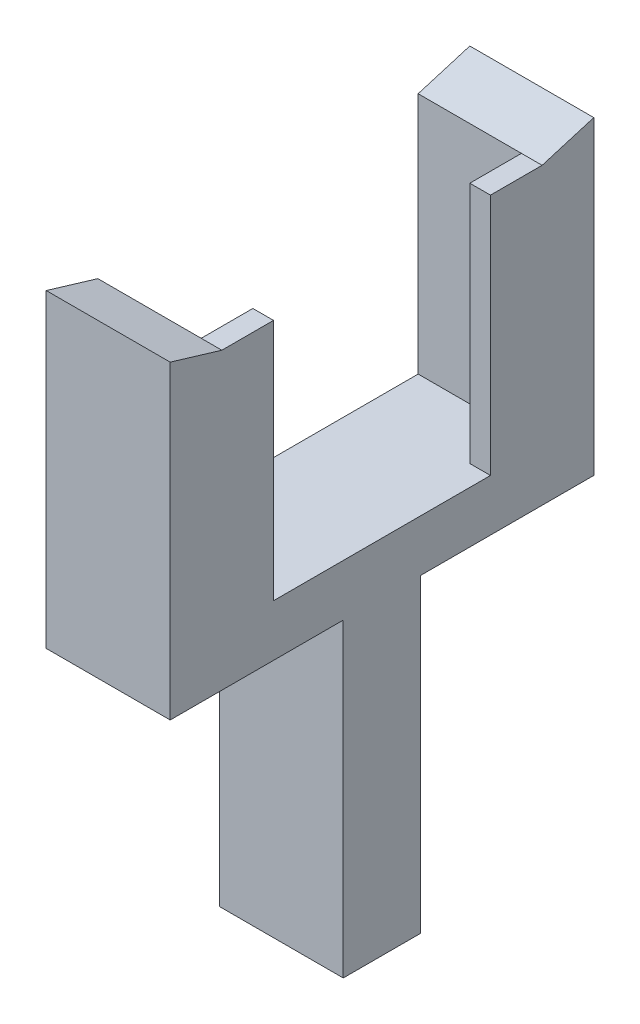
ISO-10303-21;
HEADER;
FILE_DESCRIPTION(('STEP AP214'),'2;1');
FILE_NAME('part.step','',(''),(''),'','','');
FILE_SCHEMA(('AUTOMOTIVE_DESIGN { 1 0 10303 214 1 1 1 1 }'));
ENDSEC;
DATA;
#1=APPLICATION_CONTEXT('core data for automotive mechanical design processes');
#2=APPLICATION_PROTOCOL_DEFINITION('international standard','automotive_design',2000,#1);
#3=PRODUCT_CONTEXT('',#1,'mechanical');
#4=PRODUCT('Part','Part','',(#3));
#5=PRODUCT_RELATED_PRODUCT_CATEGORY('part','',(#4));
#6=PRODUCT_DEFINITION_FORMATION('','',#4);
#7=PRODUCT_DEFINITION_CONTEXT('part definition',#1,'design');
#8=PRODUCT_DEFINITION('design','',#6,#7);
#9=PRODUCT_DEFINITION_SHAPE('','',#8);
#10=(LENGTH_UNIT() NAMED_UNIT(*) SI_UNIT(.MILLI.,.METRE.));
#11=(NAMED_UNIT(*) PLANE_ANGLE_UNIT() SI_UNIT($,.RADIAN.));
#12=(NAMED_UNIT(*) SI_UNIT($,.STERADIAN.) SOLID_ANGLE_UNIT());
#13=UNCERTAINTY_MEASURE_WITH_UNIT(LENGTH_MEASURE(1.E-05),#10,'distance_accuracy_value','');
#14=(GEOMETRIC_REPRESENTATION_CONTEXT(3) GLOBAL_UNCERTAINTY_ASSIGNED_CONTEXT((#13)) GLOBAL_UNIT_ASSIGNED_CONTEXT((#10,
#11,#12)) REPRESENTATION_CONTEXT('',''));
#15=CARTESIAN_POINT('',(0.,0.,0.));
#16=DIRECTION('',(0.,0.,1.));
#17=DIRECTION('',(1.,0.,0.));
#18=AXIS2_PLACEMENT_3D('',#15,#16,#17);
#19=CARTESIAN_POINT('',(6.,5.64115646258503,15.5));
#20=DIRECTION('',(0.,-1.,0.));
#21=DIRECTION('',(0.,0.,-1.));
#22=AXIS2_PLACEMENT_3D('',#19,#20,#21);
#23=PLANE('',#22);
#24=DIRECTION('',(-1.,0.,0.));
#25=VECTOR('',#24,1.);
#26=CARTESIAN_POINT('',(6.,5.64115646258503,-10.5));
#27=LINE('',#26,#25);
#28=CARTESIAN_POINT('',(6.,5.64115646258503,-10.5));
#29=VERTEX_POINT('',#28);
#30=CARTESIAN_POINT('',(4.,5.64115646258503,-10.5));
#31=VERTEX_POINT('',#30);
#32=EDGE_CURVE('E316',#29,#31,#27,.T.);
#33=ORIENTED_EDGE('',*,*,#32,.T.);
#34=DIRECTION('',(0.,0.,-1.));
#35=VECTOR('',#34,1.);
#36=CARTESIAN_POINT('',(4.,5.64115646258503,-10.5));
#37=LINE('',#36,#35);
#38=CARTESIAN_POINT('',(4.,5.64115646258503,-15.5));
#39=VERTEX_POINT('',#38);
#40=EDGE_CURVE('E312',#31,#39,#37,.T.);
#41=ORIENTED_EDGE('',*,*,#40,.T.);
#42=DIRECTION('',(-1.,0.,0.));
#43=VECTOR('',#42,1.);
#44=CARTESIAN_POINT('',(6.,5.64115646258503,-15.5));
#45=LINE('',#44,#43);
#46=CARTESIAN_POINT('',(-6.,5.64115646258503,-15.5));
#47=VERTEX_POINT('',#46);
#48=EDGE_CURVE('E215',#39,#47,#45,.T.);
#49=ORIENTED_EDGE('',*,*,#48,.T.);
#50=DIRECTION('',(0.,0.,1.));
#51=VECTOR('',#50,1.);
#52=CARTESIAN_POINT('',(-6.,5.64115646258503,15.5));
#53=LINE('',#52,#51);
#54=CARTESIAN_POINT('',(-6.,5.64115646258503,15.5));
#55=VERTEX_POINT('',#54);
#56=EDGE_CURVE('E183',#47,#55,#53,.T.);
#57=ORIENTED_EDGE('',*,*,#56,.T.);
#58=DIRECTION('',(-1.,0.,0.));
#59=VECTOR('',#58,1.);
#60=CARTESIAN_POINT('',(6.,5.64115646258503,15.5));
#61=LINE('',#60,#59);
#62=CARTESIAN_POINT('',(4.,5.64115646258503,15.5));
#63=VERTEX_POINT('',#62);
#64=EDGE_CURVE('E212',#63,#55,#61,.T.);
#65=ORIENTED_EDGE('',*,*,#64,.F.);
#66=DIRECTION('',(0.,0.,1.));
#67=VECTOR('',#66,1.);
#68=CARTESIAN_POINT('',(4.,5.64115646258503,10.5));
#69=LINE('',#68,#67);
#70=CARTESIAN_POINT('',(4.,5.64115646258503,10.5));
#71=VERTEX_POINT('',#70);
#72=EDGE_CURVE('E166',#71,#63,#69,.T.);
#73=ORIENTED_EDGE('',*,*,#72,.F.);
#74=DIRECTION('',(-1.,0.,0.));
#75=VECTOR('',#74,1.);
#76=CARTESIAN_POINT('',(6.,5.64115646258503,10.5));
#77=LINE('',#76,#75);
#78=CARTESIAN_POINT('',(6.,5.64115646258503,10.5));
#79=VERTEX_POINT('',#78);
#80=EDGE_CURVE('E298',#79,#71,#77,.T.);
#81=ORIENTED_EDGE('',*,*,#80,.F.);
#82=DIRECTION('',(0.,0.,1.));
#83=VECTOR('',#82,1.);
#84=CARTESIAN_POINT('',(6.,5.64115646258503,15.5));
#85=LINE('',#84,#83);
#86=EDGE_CURVE('E258',#29,#79,#85,.T.);
#87=ORIENTED_EDGE('',*,*,#86,.F.);
#88=EDGE_LOOP('',(#33,#41,#49,#57,#65,#73,#81,#87));
#89=FACE_BOUND('',#88,.T.);
#90=ADVANCED_FACE('F39',(#89),#23,.F.);
#91=CARTESIAN_POINT('',(6.,29.141156462585,15.5));
#92=DIRECTION('',(0.,0.,1.));
#93=DIRECTION('',(0.,-1.,0.));
#94=AXIS2_PLACEMENT_3D('',#91,#92,#93);
#95=PLANE('',#94);
#96=DIRECTION('',(0.,1.,0.));
#97=VECTOR('',#96,1.);
#98=CARTESIAN_POINT('',(4.,29.141156462585,15.5));
#99=LINE('',#98,#97);
#100=CARTESIAN_POINT('',(4.,29.141156462585,15.5));
#101=VERTEX_POINT('',#100);
#102=EDGE_CURVE('E285',#63,#101,#99,.T.);
#103=ORIENTED_EDGE('',*,*,#102,.F.);
#104=ORIENTED_EDGE('',*,*,#64,.T.);
#105=DIRECTION('',(0.,1.,0.));
#106=VECTOR('',#105,1.);
#107=CARTESIAN_POINT('',(-6.,29.141156462585,15.5));
#108=LINE('',#107,#106);
#109=CARTESIAN_POINT('',(-6.,29.141156462585,15.5));
#110=VERTEX_POINT('',#109);
#111=EDGE_CURVE('E187',#55,#110,#108,.T.);
#112=ORIENTED_EDGE('',*,*,#111,.T.);
#113=DIRECTION('',(-1.,0.,0.));
#114=VECTOR('',#113,1.);
#115=CARTESIAN_POINT('',(6.,29.141156462585,15.5));
#116=LINE('',#115,#114);
#117=EDGE_CURVE('E207',#101,#110,#116,.T.);
#118=ORIENTED_EDGE('',*,*,#117,.F.);
#119=EDGE_LOOP('',(#103,#104,#112,#118));
#120=FACE_BOUND('',#119,.T.);
#121=ADVANCED_FACE('F394',(#120),#95,.F.);
#122=CARTESIAN_POINT('',(6.,-29.358843537415,3.74999999999999));
#123=DIRECTION('',(0.,1.,0.));
#124=DIRECTION('',(0.,0.,1.));
#125=AXIS2_PLACEMENT_3D('',#122,#123,#124);
#126=PLANE('',#125);
#127=DIRECTION('',(0.,0.,-1.));
#128=VECTOR('',#127,1.);
#129=CARTESIAN_POINT('',(-6.,-29.358843537415,3.74999999999999));
#130=LINE('',#129,#128);
#131=CARTESIAN_POINT('',(-6.,-29.358843537415,3.74999999999999));
#132=VERTEX_POINT('',#131);
#133=CARTESIAN_POINT('',(-6.,-29.358843537415,-3.75000000000001));
#134=VERTEX_POINT('',#133);
#135=EDGE_CURVE('E161',#132,#134,#130,.T.);
#136=ORIENTED_EDGE('',*,*,#135,.T.);
#137=DIRECTION('',(-1.,0.,0.));
#138=VECTOR('',#137,1.);
#139=CARTESIAN_POINT('',(6.,-29.358843537415,-3.75000000000001));
#140=LINE('',#139,#138);
#141=CARTESIAN_POINT('',(6.,-29.358843537415,-3.75000000000001));
#142=VERTEX_POINT('',#141);
#143=EDGE_CURVE('E11',#142,#134,#140,.T.);
#144=ORIENTED_EDGE('',*,*,#143,.F.);
#145=DIRECTION('',(0.,0.,-1.));
#146=VECTOR('',#145,1.);
#147=CARTESIAN_POINT('',(6.,-29.358843537415,3.74999999999999));
#148=LINE('',#147,#146);
#149=CARTESIAN_POINT('',(6.,-29.358843537415,3.74999999999999));
#150=VERTEX_POINT('',#149);
#151=EDGE_CURVE('E200',#150,#142,#148,.T.);
#152=ORIENTED_EDGE('',*,*,#151,.F.);
#153=DIRECTION('',(-1.,0.,0.));
#154=VECTOR('',#153,1.);
#155=CARTESIAN_POINT('',(6.,-29.358843537415,3.74999999999999));
#156=LINE('',#155,#154);
#157=EDGE_CURVE('E157',#150,#132,#156,.T.);
#158=ORIENTED_EDGE('',*,*,#157,.T.);
#159=EDGE_LOOP('',(#136,#144,#152,#158));
#160=FACE_BOUND('',#159,.T.);
#161=ADVANCED_FACE('F41',(#160),#126,.F.);
#162=CARTESIAN_POINT('',(6.,-29.358843537415,-3.75000000000001));
#163=DIRECTION('',(0.,0.,1.));
#164=DIRECTION('',(0.,-1.,0.));
#165=AXIS2_PLACEMENT_3D('',#162,#163,#164);
#166=PLANE('',#165);
#167=DIRECTION('',(0.,1.,0.));
#168=VECTOR('',#167,1.);
#169=CARTESIAN_POINT('',(-6.,-29.358843537415,-3.75000000000001));
#170=LINE('',#169,#168);
#171=CARTESIAN_POINT('',(-6.,0.641156462585026,-3.75));
#172=VERTEX_POINT('',#171);
#173=EDGE_CURVE('E165',#134,#172,#170,.T.);
#174=ORIENTED_EDGE('',*,*,#173,.T.);
#175=DIRECTION('',(-1.,0.,0.));
#176=VECTOR('',#175,1.);
#177=CARTESIAN_POINT('',(6.,0.641156462585026,-3.75));
#178=LINE('',#177,#176);
#179=CARTESIAN_POINT('',(6.,0.641156462585026,-3.75));
#180=VERTEX_POINT('',#179);
#181=EDGE_CURVE('E49',#180,#172,#178,.T.);
#182=ORIENTED_EDGE('',*,*,#181,.F.);
#183=DIRECTION('',(0.,1.,0.));
#184=VECTOR('',#183,1.);
#185=CARTESIAN_POINT('',(6.,-29.358843537415,-3.75000000000001));
#186=LINE('',#185,#184);
#187=EDGE_CURVE('E113',#142,#180,#186,.T.);
#188=ORIENTED_EDGE('',*,*,#187,.F.);
#189=ORIENTED_EDGE('',*,*,#143,.T.);
#190=EDGE_LOOP('',(#174,#182,#188,#189));
#191=FACE_BOUND('',#190,.T.);
#192=ADVANCED_FACE('F426',(#191),#166,.F.);
#193=CARTESIAN_POINT('',(6.,0.641156462585026,-3.75));
#194=DIRECTION('',(0.,1.,0.));
#195=DIRECTION('',(0.,0.,1.));
#196=AXIS2_PLACEMENT_3D('',#193,#194,#195);
#197=PLANE('',#196);
#198=DIRECTION('',(0.,0.,-1.));
#199=VECTOR('',#198,1.);
#200=CARTESIAN_POINT('',(-6.,0.641156462585026,-3.75));
#201=LINE('',#200,#199);
#202=CARTESIAN_POINT('',(-6.,0.641156462585028,-20.5));
#203=VERTEX_POINT('',#202);
#204=EDGE_CURVE('E169',#172,#203,#201,.T.);
#205=ORIENTED_EDGE('',*,*,#204,.T.);
#206=DIRECTION('',(-1.,0.,0.));
#207=VECTOR('',#206,1.);
#208=CARTESIAN_POINT('',(6.,0.641156462585028,-20.5));
#209=LINE('',#208,#207);
#210=CARTESIAN_POINT('',(6.,0.641156462585028,-20.5));
#211=VERTEX_POINT('',#210);
#212=EDGE_CURVE('E227',#211,#203,#209,.T.);
#213=ORIENTED_EDGE('',*,*,#212,.F.);
#214=DIRECTION('',(0.,0.,-1.));
#215=VECTOR('',#214,1.);
#216=CARTESIAN_POINT('',(6.,0.641156462585026,-3.75));
#217=LINE('',#216,#215);
#218=EDGE_CURVE('E237',#180,#211,#217,.T.);
#219=ORIENTED_EDGE('',*,*,#218,.F.);
#220=ORIENTED_EDGE('',*,*,#181,.T.);
#221=EDGE_LOOP('',(#205,#213,#219,#220));
#222=FACE_BOUND('',#221,.T.);
#223=ADVANCED_FACE('F235',(#222),#197,.F.);
#224=CARTESIAN_POINT('',(6.,0.641156462585028,-20.5));
#225=DIRECTION('',(0.,0.,1.));
#226=DIRECTION('',(0.,-1.,0.));
#227=AXIS2_PLACEMENT_3D('',#224,#225,#226);
#228=PLANE('',#227);
#229=DIRECTION('',(0.,1.,0.));
#230=VECTOR('',#229,1.);
#231=CARTESIAN_POINT('',(-6.,0.641156462585028,-20.5));
#232=LINE('',#231,#230);
#233=CARTESIAN_POINT('',(-6.,30.641156462585,-20.5));
#234=VERTEX_POINT('',#233);
#235=EDGE_CURVE('E172',#203,#234,#232,.T.);
#236=ORIENTED_EDGE('',*,*,#235,.T.);
#237=DIRECTION('',(-1.,0.,0.));
#238=VECTOR('',#237,1.);
#239=CARTESIAN_POINT('',(6.,30.641156462585,-20.5));
#240=LINE('',#239,#238);
#241=CARTESIAN_POINT('',(6.,30.641156462585,-20.5));
#242=VERTEX_POINT('',#241);
#243=EDGE_CURVE('E223',#242,#234,#240,.T.);
#244=ORIENTED_EDGE('',*,*,#243,.F.);
#245=DIRECTION('',(0.,1.,0.));
#246=VECTOR('',#245,1.);
#247=CARTESIAN_POINT('',(6.,0.641156462585028,-20.5));
#248=LINE('',#247,#246);
#249=EDGE_CURVE('E259',#211,#242,#248,.T.);
#250=ORIENTED_EDGE('',*,*,#249,.F.);
#251=ORIENTED_EDGE('',*,*,#212,.T.);
#252=EDGE_LOOP('',(#236,#244,#250,#251));
#253=FACE_BOUND('',#252,.T.);
#254=ADVANCED_FACE('F246',(#253),#228,.F.);
#255=CARTESIAN_POINT('',(6.,30.641156462585,-20.5));
#256=DIRECTION('',(0.,-0.957826285221152,-0.287347885566344));
#257=DIRECTION('',(0.,0.287347885566344,-0.957826285221152));
#258=AXIS2_PLACEMENT_3D('',#255,#256,#257);
#259=PLANE('',#258);
#260=DIRECTION('',(0.,-0.287347885566344,0.957826285221152));
#261=VECTOR('',#260,1.);
#262=CARTESIAN_POINT('',(-6.,30.641156462585,-20.5));
#263=LINE('',#262,#261);
#264=CARTESIAN_POINT('',(-6.,29.141156462585,-15.5));
#265=VERTEX_POINT('',#264);
#266=EDGE_CURVE('E175',#234,#265,#263,.T.);
#267=ORIENTED_EDGE('',*,*,#266,.T.);
#268=DIRECTION('',(-1.,0.,0.));
#269=VECTOR('',#268,1.);
#270=CARTESIAN_POINT('',(6.,29.141156462585,-15.5));
#271=LINE('',#270,#269);
#272=CARTESIAN_POINT('',(4.,29.141156462585,-15.5));
#273=VERTEX_POINT('',#272);
#274=EDGE_CURVE('E218',#273,#265,#271,.T.);
#275=ORIENTED_EDGE('',*,*,#274,.F.);
#276=CARTESIAN_POINT('',(6.,29.141156462585,-15.5));
#277=VERTEX_POINT('',#276);
#278=EDGE_CURVE('E219',#277,#273,#271,.T.);
#279=ORIENTED_EDGE('',*,*,#278,.F.);
#280=DIRECTION('',(0.,-0.287347885566344,0.957826285221152));
#281=VECTOR('',#280,1.);
#282=CARTESIAN_POINT('',(6.,30.641156462585,-20.5));
#283=LINE('',#282,#281);
#284=EDGE_CURVE('E254',#242,#277,#283,.T.);
#285=ORIENTED_EDGE('',*,*,#284,.F.);
#286=ORIENTED_EDGE('',*,*,#243,.T.);
#287=EDGE_LOOP('',(#267,#275,#279,#285,#286));
#288=FACE_BOUND('',#287,.T.);
#289=ADVANCED_FACE('F250',(#288),#259,.F.);
#290=CARTESIAN_POINT('',(6.,29.141156462585,-15.5));
#291=DIRECTION('',(0.,0.,-1.));
#292=DIRECTION('',(0.,1.,0.));
#293=AXIS2_PLACEMENT_3D('',#290,#291,#292);
#294=PLANE('',#293);
#295=ORIENTED_EDGE('',*,*,#48,.F.);
#296=DIRECTION('',(0.,1.,0.));
#297=VECTOR('',#296,1.);
#298=CARTESIAN_POINT('',(4.,29.141156462585,-15.5));
#299=LINE('',#298,#297);
#300=EDGE_CURVE('E317',#39,#273,#299,.T.);
#301=ORIENTED_EDGE('',*,*,#300,.T.);
#302=ORIENTED_EDGE('',*,*,#274,.T.);
#303=DIRECTION('',(0.,-1.,0.));
#304=VECTOR('',#303,1.);
#305=CARTESIAN_POINT('',(-6.,29.141156462585,-15.5));
#306=LINE('',#305,#304);
#307=EDGE_CURVE('E179',#265,#47,#306,.T.);
#308=ORIENTED_EDGE('',*,*,#307,.T.);
#309=EDGE_LOOP('',(#295,#301,#302,#308));
#310=FACE_BOUND('',#309,.T.);
#311=ADVANCED_FACE('F389',(#310),#294,.F.);
#312=CARTESIAN_POINT('',(6.,30.641156462585,20.5));
#313=DIRECTION('',(0.,-0.957826285221152,0.287347885566344));
#314=DIRECTION('',(0.,-0.287347885566344,-0.957826285221152));
#315=AXIS2_PLACEMENT_3D('',#312,#313,#314);
#316=PLANE('',#315);
#317=DIRECTION('',(0.,0.287347885566344,0.957826285221152));
#318=VECTOR('',#317,1.);
#319=CARTESIAN_POINT('',(-6.,30.641156462585,20.5));
#320=LINE('',#319,#318);
#321=CARTESIAN_POINT('',(-6.,30.641156462585,20.5));
#322=VERTEX_POINT('',#321);
#323=EDGE_CURVE('E191',#110,#322,#320,.T.);
#324=ORIENTED_EDGE('',*,*,#323,.T.);
#325=DIRECTION('',(-1.,0.,0.));
#326=VECTOR('',#325,1.);
#327=CARTESIAN_POINT('',(6.,30.641156462585,20.5));
#328=LINE('',#327,#326);
#329=CARTESIAN_POINT('',(6.,30.641156462585,20.5));
#330=VERTEX_POINT('',#329);
#331=EDGE_CURVE('E150',#330,#322,#328,.T.);
#332=ORIENTED_EDGE('',*,*,#331,.F.);
#333=DIRECTION('',(0.,0.287347885566344,0.957826285221152));
#334=VECTOR('',#333,1.);
#335=CARTESIAN_POINT('',(6.,30.641156462585,20.5));
#336=LINE('',#335,#334);
#337=CARTESIAN_POINT('',(6.,29.141156462585,15.5));
#338=VERTEX_POINT('',#337);
#339=EDGE_CURVE('E139',#338,#330,#336,.T.);
#340=ORIENTED_EDGE('',*,*,#339,.F.);
#341=EDGE_CURVE('E208',#338,#101,#116,.T.);
#342=ORIENTED_EDGE('',*,*,#341,.T.);
#343=ORIENTED_EDGE('',*,*,#117,.T.);
#344=EDGE_LOOP('',(#324,#332,#340,#342,#343));
#345=FACE_BOUND('',#344,.T.);
#346=ADVANCED_FACE('F397',(#345),#316,.F.);
#347=CARTESIAN_POINT('',(6.,0.641156462585023,20.5));
#348=DIRECTION('',(0.,0.,-1.));
#349=DIRECTION('',(-1.,0.,0.));
#350=AXIS2_PLACEMENT_3D('',#347,#348,#349);
#351=PLANE('',#350);
#352=DIRECTION('',(0.,-1.,0.));
#353=VECTOR('',#352,1.);
#354=CARTESIAN_POINT('',(-6.,0.641156462585023,20.5));
#355=LINE('',#354,#353);
#356=CARTESIAN_POINT('',(-6.,0.641156462585023,20.5));
#357=VERTEX_POINT('',#356);
#358=EDGE_CURVE('E148',#322,#357,#355,.T.);
#359=ORIENTED_EDGE('',*,*,#358,.T.);
#360=DIRECTION('',(-1.,0.,0.));
#361=VECTOR('',#360,1.);
#362=CARTESIAN_POINT('',(6.,0.641156462585023,20.5));
#363=LINE('',#362,#361);
#364=CARTESIAN_POINT('',(6.,0.641156462585023,20.5));
#365=VERTEX_POINT('',#364);
#366=EDGE_CURVE('E145',#365,#357,#363,.T.);
#367=ORIENTED_EDGE('',*,*,#366,.F.);
#368=DIRECTION('',(0.,-1.,0.));
#369=VECTOR('',#368,1.);
#370=CARTESIAN_POINT('',(6.,0.641156462585023,20.5));
#371=LINE('',#370,#369);
#372=EDGE_CURVE('E132',#330,#365,#371,.T.);
#373=ORIENTED_EDGE('',*,*,#372,.F.);
#374=ORIENTED_EDGE('',*,*,#331,.T.);
#375=EDGE_LOOP('',(#359,#367,#373,#374));
#376=FACE_BOUND('',#375,.T.);
#377=ADVANCED_FACE('F146',(#376),#351,.F.);
#378=CARTESIAN_POINT('',(6.,0.641156462585025,3.74999999999999));
#379=DIRECTION('',(0.,1.,0.));
#380=DIRECTION('',(0.,0.,1.));
#381=AXIS2_PLACEMENT_3D('',#378,#379,#380);
#382=PLANE('',#381);
#383=DIRECTION('',(0.,0.,-1.));
#384=VECTOR('',#383,1.);
#385=CARTESIAN_POINT('',(-6.,0.641156462585025,3.74999999999999));
#386=LINE('',#385,#384);
#387=CARTESIAN_POINT('',(-6.,0.641156462585025,3.74999999999999));
#388=VERTEX_POINT('',#387);
#389=EDGE_CURVE('E99',#357,#388,#386,.T.);
#390=ORIENTED_EDGE('',*,*,#389,.T.);
#391=DIRECTION('',(-1.,0.,0.));
#392=VECTOR('',#391,1.);
#393=CARTESIAN_POINT('',(6.,0.641156462585025,3.74999999999999));
#394=LINE('',#393,#392);
#395=CARTESIAN_POINT('',(6.,0.641156462585025,3.74999999999999));
#396=VERTEX_POINT('',#395);
#397=EDGE_CURVE('E151',#396,#388,#394,.T.);
#398=ORIENTED_EDGE('',*,*,#397,.F.);
#399=DIRECTION('',(0.,0.,-1.));
#400=VECTOR('',#399,1.);
#401=CARTESIAN_POINT('',(6.,0.641156462585025,3.74999999999999));
#402=LINE('',#401,#400);
#403=EDGE_CURVE('E137',#365,#396,#402,.T.);
#404=ORIENTED_EDGE('',*,*,#403,.F.);
#405=ORIENTED_EDGE('',*,*,#366,.T.);
#406=EDGE_LOOP('',(#390,#398,#404,#405));
#407=FACE_BOUND('',#406,.T.);
#408=ADVANCED_FACE('F153',(#407),#382,.F.);
#409=CARTESIAN_POINT('',(6.,-29.358843537415,3.74999999999999));
#410=DIRECTION('',(0.,0.,-1.));
#411=DIRECTION('',(-1.,0.,0.));
#412=AXIS2_PLACEMENT_3D('',#409,#410,#411);
#413=PLANE('',#412);
#414=DIRECTION('',(0.,-1.,0.));
#415=VECTOR('',#414,1.);
#416=CARTESIAN_POINT('',(-6.,-29.358843537415,3.74999999999999));
#417=LINE('',#416,#415);
#418=EDGE_CURVE('E105',#388,#132,#417,.T.);
#419=ORIENTED_EDGE('',*,*,#418,.T.);
#420=ORIENTED_EDGE('',*,*,#157,.F.);
#421=DIRECTION('',(0.,-1.,0.));
#422=VECTOR('',#421,1.);
#423=CARTESIAN_POINT('',(6.,-29.358843537415,3.74999999999999));
#424=LINE('',#423,#422);
#425=EDGE_CURVE('E57',#396,#150,#424,.T.);
#426=ORIENTED_EDGE('',*,*,#425,.F.);
#427=ORIENTED_EDGE('',*,*,#397,.T.);
#428=EDGE_LOOP('',(#419,#420,#426,#427));
#429=FACE_BOUND('',#428,.T.);
#430=ADVANCED_FACE('F401',(#429),#413,.F.);
#431=CARTESIAN_POINT('',(6.,0.,0.));
#432=DIRECTION('',(1.,0.,0.));
#433=DIRECTION('',(0.,0.,-1.));
#434=AXIS2_PLACEMENT_3D('',#431,#432,#433);
#435=PLANE('',#434);
#436=DIRECTION('',(0.,-1.,0.));
#437=VECTOR('',#436,1.);
#438=CARTESIAN_POINT('',(6.,29.141156462585,-10.5));
#439=LINE('',#438,#437);
#440=CARTESIAN_POINT('',(6.,29.141156462585,-10.5));
#441=VERTEX_POINT('',#440);
#442=EDGE_CURVE('E321',#441,#29,#439,.T.);
#443=ORIENTED_EDGE('',*,*,#442,.T.);
#444=ORIENTED_EDGE('',*,*,#86,.T.);
#445=DIRECTION('',(0.,-1.,0.));
#446=VECTOR('',#445,1.);
#447=CARTESIAN_POINT('',(6.,29.141156462585,10.5));
#448=LINE('',#447,#446);
#449=CARTESIAN_POINT('',(6.,29.141156462585,10.5));
#450=VERTEX_POINT('',#449);
#451=EDGE_CURVE('E289',#450,#79,#448,.T.);
#452=ORIENTED_EDGE('',*,*,#451,.F.);
#453=DIRECTION('',(0.,0.,1.));
#454=VECTOR('',#453,1.);
#455=CARTESIAN_POINT('',(6.,29.141156462585,10.5));
#456=LINE('',#455,#454);
#457=EDGE_CURVE('E281',#450,#338,#456,.T.);
#458=ORIENTED_EDGE('',*,*,#457,.T.);
#459=ORIENTED_EDGE('',*,*,#339,.T.);
#460=ORIENTED_EDGE('',*,*,#372,.T.);
#461=ORIENTED_EDGE('',*,*,#403,.T.);
#462=ORIENTED_EDGE('',*,*,#425,.T.);
#463=ORIENTED_EDGE('',*,*,#151,.T.);
#464=ORIENTED_EDGE('',*,*,#187,.T.);
#465=ORIENTED_EDGE('',*,*,#218,.T.);
#466=ORIENTED_EDGE('',*,*,#249,.T.);
#467=ORIENTED_EDGE('',*,*,#284,.T.);
#468=DIRECTION('',(0.,0.,-1.));
#469=VECTOR('',#468,1.);
#470=CARTESIAN_POINT('',(6.,29.141156462585,-10.5));
#471=LINE('',#470,#469);
#472=EDGE_CURVE('E290',#441,#277,#471,.T.);
#473=ORIENTED_EDGE('',*,*,#472,.F.);
#474=EDGE_LOOP('',(#443,#444,#452,#458,#459,#460,#461,#462,#463,#464,#465,#466,#467,#473));
#475=FACE_BOUND('',#474,.T.);
#476=ADVANCED_FACE('F135',(#475),#435,.T.);
#477=CARTESIAN_POINT('',(-6.,0.,0.));
#478=DIRECTION('',(1.,0.,0.));
#479=DIRECTION('',(0.,0.,-1.));
#480=AXIS2_PLACEMENT_3D('',#477,#478,#479);
#481=PLANE('',#480);
#482=ORIENTED_EDGE('',*,*,#135,.F.);
#483=ORIENTED_EDGE('',*,*,#418,.F.);
#484=ORIENTED_EDGE('',*,*,#389,.F.);
#485=ORIENTED_EDGE('',*,*,#358,.F.);
#486=ORIENTED_EDGE('',*,*,#323,.F.);
#487=ORIENTED_EDGE('',*,*,#111,.F.);
#488=ORIENTED_EDGE('',*,*,#56,.F.);
#489=ORIENTED_EDGE('',*,*,#307,.F.);
#490=ORIENTED_EDGE('',*,*,#266,.F.);
#491=ORIENTED_EDGE('',*,*,#235,.F.);
#492=ORIENTED_EDGE('',*,*,#204,.F.);
#493=ORIENTED_EDGE('',*,*,#173,.F.);
#494=EDGE_LOOP('',(#482,#483,#484,#485,#486,#487,#488,#489,#490,#491,#492,#493));
#495=FACE_BOUND('',#494,.T.);
#496=ADVANCED_FACE('F241',(#495),#481,.F.);
#497=CARTESIAN_POINT('',(4.,29.141156462585,10.5));
#498=DIRECTION('',(1.,0.,0.));
#499=DIRECTION('',(0.,0.,-1.));
#500=AXIS2_PLACEMENT_3D('',#497,#498,#499);
#501=PLANE('',#500);
#502=ORIENTED_EDGE('',*,*,#102,.T.);
#503=DIRECTION('',(0.,0.,1.));
#504=VECTOR('',#503,1.);
#505=CARTESIAN_POINT('',(4.,29.141156462585,10.5));
#506=LINE('',#505,#504);
#507=CARTESIAN_POINT('',(4.,29.141156462585,10.5));
#508=VERTEX_POINT('',#507);
#509=EDGE_CURVE('E277',#508,#101,#506,.T.);
#510=ORIENTED_EDGE('',*,*,#509,.F.);
#511=DIRECTION('',(0.,1.,0.));
#512=VECTOR('',#511,1.);
#513=CARTESIAN_POINT('',(4.,29.141156462585,10.5));
#514=LINE('',#513,#512);
#515=EDGE_CURVE('E294',#71,#508,#514,.T.);
#516=ORIENTED_EDGE('',*,*,#515,.F.);
#517=ORIENTED_EDGE('',*,*,#72,.T.);
#518=EDGE_LOOP('',(#502,#510,#516,#517));
#519=FACE_BOUND('',#518,.T.);
#520=ADVANCED_FACE('F361',(#519),#501,.F.);
#521=CARTESIAN_POINT('',(6.,29.141156462585,10.5));
#522=DIRECTION('',(0.,-1.,0.));
#523=DIRECTION('',(0.,0.,-1.));
#524=AXIS2_PLACEMENT_3D('',#521,#522,#523);
#525=PLANE('',#524);
#526=ORIENTED_EDGE('',*,*,#341,.F.);
#527=ORIENTED_EDGE('',*,*,#457,.F.);
#528=DIRECTION('',(1.,0.,0.));
#529=VECTOR('',#528,1.);
#530=CARTESIAN_POINT('',(6.,29.141156462585,10.5));
#531=LINE('',#530,#529);
#532=EDGE_CURVE('E284',#508,#450,#531,.T.);
#533=ORIENTED_EDGE('',*,*,#532,.F.);
#534=ORIENTED_EDGE('',*,*,#509,.T.);
#535=EDGE_LOOP('',(#526,#527,#533,#534));
#536=FACE_BOUND('',#535,.T.);
#537=ADVANCED_FACE('F369',(#536),#525,.F.);
#538=CARTESIAN_POINT('',(0.,0.,10.5));
#539=DIRECTION('',(0.,0.,-1.));
#540=DIRECTION('',(0.,1.,0.));
#541=AXIS2_PLACEMENT_3D('',#538,#539,#540);
#542=PLANE('',#541);
#543=ORIENTED_EDGE('',*,*,#451,.T.);
#544=ORIENTED_EDGE('',*,*,#80,.T.);
#545=ORIENTED_EDGE('',*,*,#515,.T.);
#546=ORIENTED_EDGE('',*,*,#532,.T.);
#547=EDGE_LOOP('',(#543,#544,#545,#546));
#548=FACE_BOUND('',#547,.T.);
#549=ADVANCED_FACE('F356',(#548),#542,.T.);
#550=CARTESIAN_POINT('',(6.,29.141156462585,-10.5));
#551=DIRECTION('',(0.,1.,0.));
#552=DIRECTION('',(0.,0.,1.));
#553=AXIS2_PLACEMENT_3D('',#550,#551,#552);
#554=PLANE('',#553);
#555=ORIENTED_EDGE('',*,*,#278,.T.);
#556=DIRECTION('',(0.,0.,-1.));
#557=VECTOR('',#556,1.);
#558=CARTESIAN_POINT('',(4.,29.141156462585,-10.5));
#559=LINE('',#558,#557);
#560=CARTESIAN_POINT('',(4.,29.141156462585,-10.5));
#561=VERTEX_POINT('',#560);
#562=EDGE_CURVE('E308',#561,#273,#559,.T.);
#563=ORIENTED_EDGE('',*,*,#562,.F.);
#564=DIRECTION('',(1.,0.,0.));
#565=VECTOR('',#564,1.);
#566=CARTESIAN_POINT('',(6.,29.141156462585,-10.5));
#567=LINE('',#566,#565);
#568=EDGE_CURVE('E329',#561,#441,#567,.T.);
#569=ORIENTED_EDGE('',*,*,#568,.T.);
#570=ORIENTED_EDGE('',*,*,#472,.T.);
#571=EDGE_LOOP('',(#555,#563,#569,#570));
#572=FACE_BOUND('',#571,.T.);
#573=ADVANCED_FACE('F384',(#572),#554,.T.);
#574=CARTESIAN_POINT('',(4.,29.141156462585,-10.5));
#575=DIRECTION('',(-1.,0.,0.));
#576=DIRECTION('',(0.,0.,1.));
#577=AXIS2_PLACEMENT_3D('',#574,#575,#576);
#578=PLANE('',#577);
#579=ORIENTED_EDGE('',*,*,#300,.F.);
#580=ORIENTED_EDGE('',*,*,#40,.F.);
#581=DIRECTION('',(0.,1.,0.));
#582=VECTOR('',#581,1.);
#583=CARTESIAN_POINT('',(4.,29.141156462585,-10.5));
#584=LINE('',#583,#582);
#585=EDGE_CURVE('E325',#31,#561,#584,.T.);
#586=ORIENTED_EDGE('',*,*,#585,.T.);
#587=ORIENTED_EDGE('',*,*,#562,.T.);
#588=EDGE_LOOP('',(#579,#580,#586,#587));
#589=FACE_BOUND('',#588,.T.);
#590=ADVANCED_FACE('F386',(#589),#578,.T.);
#591=CARTESIAN_POINT('',(0.,0.,-10.5));
#592=DIRECTION('',(0.,0.,1.));
#593=DIRECTION('',(0.,1.,0.));
#594=AXIS2_PLACEMENT_3D('',#591,#592,#593);
#595=PLANE('',#594);
#596=ORIENTED_EDGE('',*,*,#442,.F.);
#597=ORIENTED_EDGE('',*,*,#568,.F.);
#598=ORIENTED_EDGE('',*,*,#585,.F.);
#599=ORIENTED_EDGE('',*,*,#32,.F.);
#600=EDGE_LOOP('',(#596,#597,#598,#599));
#601=FACE_BOUND('',#600,.T.);
#602=ADVANCED_FACE('F347',(#601),#595,.T.);
#603=CLOSED_SHELL('',(#90,#121,#161,#192,#223,#254,#289,#311,#346,#377,#408,#430,#476,#496,#520,
#537,#549,#573,#590,#602));
#604=MANIFOLD_SOLID_BREP('B2',#603);
#605=ADVANCED_BREP_SHAPE_REPRESENTATION('',(#18,#604),#14);
#606=SHAPE_DEFINITION_REPRESENTATION(#9,#605);
ENDSEC;
END-ISO-10303-21;
